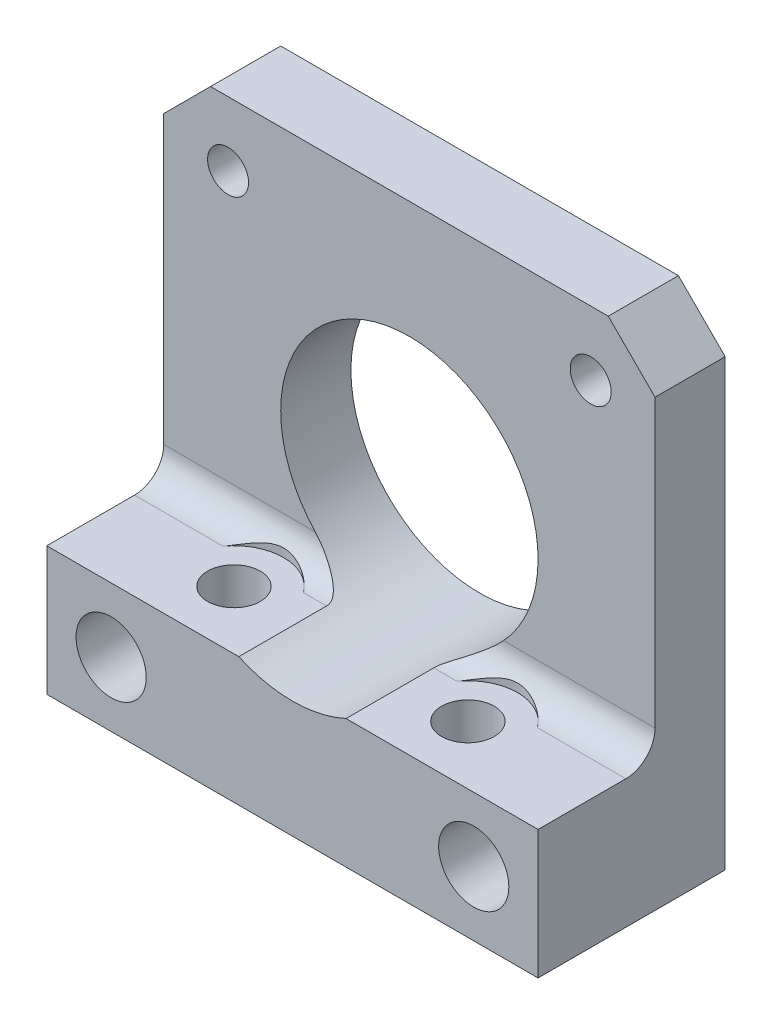
ISO-10303-21;
HEADER;
FILE_DESCRIPTION(('STEP AP214'),'2;1');
FILE_NAME('part.step','',(''),(''),'','','');
FILE_SCHEMA(('AUTOMOTIVE_DESIGN { 1 0 10303 214 1 1 1 1 }'));
ENDSEC;
DATA;
#1=APPLICATION_CONTEXT('core data for automotive mechanical design processes');
#2=APPLICATION_PROTOCOL_DEFINITION('international standard','automotive_design',2000,#1);
#3=PRODUCT_CONTEXT('',#1,'mechanical');
#4=PRODUCT('Part','Part','',(#3));
#5=PRODUCT_RELATED_PRODUCT_CATEGORY('part','',(#4));
#6=PRODUCT_DEFINITION_FORMATION('','',#4);
#7=PRODUCT_DEFINITION_CONTEXT('part definition',#1,'design');
#8=PRODUCT_DEFINITION('design','',#6,#7);
#9=PRODUCT_DEFINITION_SHAPE('','',#8);
#10=(LENGTH_UNIT() NAMED_UNIT(*) SI_UNIT(.MILLI.,.METRE.));
#11=(NAMED_UNIT(*) PLANE_ANGLE_UNIT() SI_UNIT($,.RADIAN.));
#12=(NAMED_UNIT(*) SI_UNIT($,.STERADIAN.) SOLID_ANGLE_UNIT());
#13=UNCERTAINTY_MEASURE_WITH_UNIT(LENGTH_MEASURE(1.E-05),#10,'distance_accuracy_value','');
#14=(GEOMETRIC_REPRESENTATION_CONTEXT(3) GLOBAL_UNCERTAINTY_ASSIGNED_CONTEXT((#13)) GLOBAL_UNIT_ASSIGNED_CONTEXT((#10,
#11,#12)) REPRESENTATION_CONTEXT('',''));
#15=CARTESIAN_POINT('',(0.,0.,0.));
#16=DIRECTION('',(0.,0.,1.));
#17=DIRECTION('',(1.,0.,0.));
#18=AXIS2_PLACEMENT_3D('',#15,#16,#17);
#19=CARTESIAN_POINT('',(-21.,-7.5,8.5));
#20=DIRECTION('',(1.,0.,0.));
#21=DIRECTION('',(0.,0.,-1.));
#22=AXIS2_PLACEMENT_3D('',#19,#20,#21);
#23=CYLINDRICAL_SURFACE('',#22,2.5);
#24=CARTESIAN_POINT('',(-13.4369317712169,-10.,8.5));
#25=CARTESIAN_POINT('',(-13.3736767965704,-9.99999618356325,8.41299325682662));
#26=CARTESIAN_POINT('',(-13.3071532453223,-9.99546167130543,8.32852394607757));
#27=CARTESIAN_POINT('',(-13.1684740677733,-9.97886685274589,8.16545650489552));
#28=CARTESIAN_POINT('',(-13.096332375148,-9.96682467697594,8.08684473939321));
#29=CARTESIAN_POINT('',(-12.9476116296134,-9.93685663332755,7.93647213440006));
#30=CARTESIAN_POINT('',(-12.8710729780745,-9.91897891567545,7.86466123354958));
#31=CARTESIAN_POINT('',(-12.7135575222297,-9.87869337935237,7.72738260424705));
#32=CARTESIAN_POINT('',(-12.6325777049683,-9.85628245686863,7.66191926754862));
#33=CARTESIAN_POINT('',(-12.4517332765327,-9.80393797031424,7.52631656235149));
#34=CARTESIAN_POINT('',(-12.3510925954655,-9.77337641532771,7.45745550247067));
#35=CARTESIAN_POINT('',(-12.1448344794991,-9.70990211579835,7.32890188518078));
#36=CARTESIAN_POINT('',(-12.0392164206318,-9.67698907620322,7.26921048130392));
#37=CARTESIAN_POINT('',(-11.8229898418857,-9.61083491850564,7.15890977395084));
#38=CARTESIAN_POINT('',(-11.7123671633849,-9.57759310828401,7.10832855287725));
#39=CARTESIAN_POINT('',(-11.4867506983562,-9.51317304773429,7.01667018400048));
#40=CARTESIAN_POINT('',(-11.3717583001318,-9.48199415048643,6.97559004652035));
#41=CARTESIAN_POINT('',(-11.0789229745892,-9.40972602691266,6.88513159837149));
#42=CARTESIAN_POINT('',(-10.8983570480611,-9.37145765247095,6.84184539496407));
#43=CARTESIAN_POINT('',(-10.622713680079,-9.32834928101204,6.79483732363149));
#44=CARTESIAN_POINT('',(-10.5302014624946,-9.31637083046183,6.78216152699683));
#45=CARTESIAN_POINT('',(-10.343970062805,-9.29797084052382,6.76290948773315));
#46=CARTESIAN_POINT('',(-10.2502509598634,-9.29154893852925,6.75633284708613));
#47=CARTESIAN_POINT('',(-10.0617917899725,-9.28477240703696,6.74939675099875));
#48=CARTESIAN_POINT('',(-9.96704897769375,-9.28445478156561,6.74907521375119));
#49=CARTESIAN_POINT('',(-9.77793912829719,-9.29000586110763,6.75475100424765));
#50=CARTESIAN_POINT('',(-9.68357209847319,-9.29587468561692,6.76074845404766));
#51=CARTESIAN_POINT('',(-9.49572591141823,-9.31333811746446,6.77896500769646));
#52=CARTESIAN_POINT('',(-9.40224982028795,-9.32494806377128,6.79120078165744));
#53=CARTESIAN_POINT('',(-9.21701109713077,-9.35302799513384,6.82169247043302));
#54=CARTESIAN_POINT('',(-9.12524955232062,-9.36950095964519,6.83995207671467));
#55=CARTESIAN_POINT('',(-8.80411134652349,-9.43452868932247,6.91486730613087));
#56=CARTESIAN_POINT('',(-8.58030581644891,-9.49343799958622,6.98736347630538));
#57=CARTESIAN_POINT('',(-8.25727167422108,-9.58663594007503,7.12197471168472));
#58=CARTESIAN_POINT('',(-8.15157974100833,-9.61855123681364,7.17123542341364));
#59=CARTESIAN_POINT('',(-7.94450020484713,-9.68204949175381,7.27830709290976));
#60=CARTESIAN_POINT('',(-7.8431121149628,-9.71363248724612,7.33611708007762));
#61=CARTESIAN_POINT('',(-7.57746253786431,-9.79532525473546,7.50251725423616));
#62=CARTESIAN_POINT('',(-7.41730156286126,-9.84343818967365,7.61891681704156));
#63=CARTESIAN_POINT('',(-7.18916848739681,-9.90403044519613,7.81071184814743));
#64=CARTESIAN_POINT('',(-7.11526139775998,-9.92227639686394,7.87737743695696));
#65=CARTESIAN_POINT('',(-6.9717954167563,-9.95379410121673,8.01630592334917));
#66=CARTESIAN_POINT('',(-6.90223366639453,-9.96706915382272,8.08856506907091));
#67=CARTESIAN_POINT('',(-6.78716183804682,-9.98451269274629,8.21695571460681));
#68=CARTESIAN_POINT('',(-6.74045048467771,-9.99019860897379,8.2718090475859));
#69=CARTESIAN_POINT('',(-6.64968480494346,-9.99794502801886,8.38406440392919));
#70=CARTESIAN_POINT('',(-6.60563504584181,-9.99999946085588,8.44147053041993));
#71=CARTESIAN_POINT('',(-6.56306822878312,-10.,8.5));
#72=B_SPLINE_CURVE_WITH_KNOTS('',3,(#24,#25,#26,#27,#28,#29,#30,#31,#32,#33,#34,#35,#36,#37,#38,
#39,#40,#41,#42,#43,#44,#45,#46,#47,#48,#49,#50,#51,#52,#53,#54,#55,#56,#57,#58,#59,#60,#61,#62,
#63,#64,#65,#66,#67,#68,#69,#70,#71),.UNSPECIFIED.,.F.,.F.,(4,2,2,2,2,2,2,2,2,2,2,2,2,2,2,2,2,2,
2,2,2,2,2,4),(0.,0.322350644668291,0.643925832341026,0.962912014782016,1.28211734576454,
1.65876243547026,2.03545486796295,2.41328930146921,2.79100468071832,3.35724508062752,
3.63936817002682,3.92147284737427,4.20528710292323,4.48910684065799,4.77368901077135,
5.05844590075495,5.78148620605999,6.14392890906228,6.5063304954842,7.11503257645169,
7.41832049620652,7.72140672045771,7.93804934813742,8.15505375014328),.UNSPECIFIED.);
#73=CARTESIAN_POINT('',(-13.4369317712169,-10.,8.5));
#74=VERTEX_POINT('',#73);
#75=CARTESIAN_POINT('',(-6.56306822878312,-10.,8.5));
#76=VERTEX_POINT('',#75);
#77=EDGE_CURVE('E149',#74,#76,#72,.T.);
#78=ORIENTED_EDGE('',*,*,#77,.T.);
#79=DIRECTION('',(-1.,0.,0.));
#80=VECTOR('',#79,1.);
#81=CARTESIAN_POINT('',(-21.,-10.,8.5));
#82=LINE('',#81,#80);
#83=CARTESIAN_POINT('',(-4.5825756949558,-10.,8.5));
#84=VERTEX_POINT('',#83);
#85=EDGE_CURVE('E297',#84,#76,#82,.T.);
#86=ORIENTED_EDGE('',*,*,#85,.F.);
#87=CARTESIAN_POINT('',(-8.04673846971552,-7.5,6.));
#88=CARTESIAN_POINT('',(-7.95386714442524,-7.5996710302166,6.00003103414965));
#89=CARTESIAN_POINT('',(-7.8591789413506,-7.69752175322278,6.00595755700125));
#90=CARTESIAN_POINT('',(-7.66699769287011,-7.88894158567436,6.02855548967686));
#91=CARTESIAN_POINT('',(-7.56950789643528,-7.98251535265925,6.04521489784045));
#92=CARTESIAN_POINT('',(-7.37209391217946,-8.16519456872849,6.08829129650574));
#93=CARTESIAN_POINT('',(-7.27216421924478,-8.25428818998738,6.11473271829137));
#94=CARTESIAN_POINT('',(-7.07072781079676,-8.42748174646896,6.17658913466857));
#95=CARTESIAN_POINT('',(-6.96922063219319,-8.51158017897022,6.21200681291285));
#96=CARTESIAN_POINT('',(-6.76298283366887,-8.67639808674789,6.29213337918878));
#97=CARTESIAN_POINT('',(-6.65823135258647,-8.75699749696402,6.33703495682333));
#98=CARTESIAN_POINT('',(-6.44850133910673,-8.91256837631275,6.43526850098936));
#99=CARTESIAN_POINT('',(-6.34352280187302,-8.98753972432662,6.48860064887427));
#100=CARTESIAN_POINT('',(-6.1344236232693,-9.13153456490374,6.60353860576782));
#101=CARTESIAN_POINT('',(-6.03030159674188,-9.20057086365992,6.66512582768581));
#102=CARTESIAN_POINT('',(-5.82383594434758,-9.33262700342529,6.79700577095205));
#103=CARTESIAN_POINT('',(-5.72149133048561,-9.39565028049999,6.86729346712224));
#104=CARTESIAN_POINT('',(-5.53398501082936,-9.50711430562465,7.00723035227061));
#105=CARTESIAN_POINT('',(-5.44839099409164,-9.55636976793574,7.07564634487743));
#106=CARTESIAN_POINT('',(-5.28126340632524,-9.64973645921936,7.22089837878199));
#107=CARTESIAN_POINT('',(-5.19973637325939,-9.69383954899308,7.29774738007029));
#108=CARTESIAN_POINT('',(-5.04289534688484,-9.77635551955456,7.46230666924363));
#109=CARTESIAN_POINT('',(-4.96765935063409,-9.81470064723573,7.550126890587));
#110=CARTESIAN_POINT('',(-4.82993707072984,-9.88319530281518,7.73821481104196));
#111=CARTESIAN_POINT('',(-4.76740075737949,-9.91337715195906,7.83843106107665));
#112=CARTESIAN_POINT('',(-4.68778668990944,-9.95116454534966,8.00456281999161));
#113=CARTESIAN_POINT('',(-4.66288974902919,-9.96282878465715,8.0657577634673));
#114=CARTESIAN_POINT('',(-4.62229782393996,-9.98172665554517,8.19169815546476));
#115=CARTESIAN_POINT('',(-4.60657066139216,-9.98897578455555,8.25643030565785));
#116=CARTESIAN_POINT('',(-4.59182069583853,-9.9957593907349,8.35148578075802));
#117=CARTESIAN_POINT('',(-4.5883702863823,-9.99734304727816,8.38102039118476));
#118=CARTESIAN_POINT('',(-4.58374206274924,-9.9994655741265,8.44036379213393));
#119=CARTESIAN_POINT('',(-4.58256886230142,-10.0000023233604,8.47017301659673));
#120=CARTESIAN_POINT('',(-4.5825756949558,-10.,8.5));
#121=B_SPLINE_CURVE_WITH_KNOTS('',3,(#87,#88,#89,#90,#91,#92,#93,#94,#95,#96,#97,#98,#99,#100,
#101,#102,#103,#104,#105,#106,#107,#108,#109,#110,#111,#112,#113,#114,#115,#116,#117,#118,#119,
#120),.UNSPECIFIED.,.F.,.F.,(4,2,2,2,2,2,2,2,2,2,2,2,2,2,2,2,4),(0.,0.408414030851302,
0.816372158310613,1.22535614606482,1.63446255327352,2.05285724758682,2.47126094338362,
2.88873791079982,3.30597486922085,3.66601806004669,4.02662253269252,4.39118414214763,
4.75428046319996,4.9548832058333,5.15477769477004,5.24401710489217,5.33343713016793),.UNSPECIFIED.);
#122=CARTESIAN_POINT('',(-8.04673846971552,-7.5,6.));
#123=VERTEX_POINT('',#122);
#124=EDGE_CURVE('E161',#123,#84,#121,.T.);
#125=ORIENTED_EDGE('',*,*,#124,.F.);
#126=DIRECTION('',(-1.,0.,0.));
#127=VECTOR('',#126,1.);
#128=CARTESIAN_POINT('',(-4.5825756949558,-7.5,6.));
#129=LINE('',#128,#127);
#130=CARTESIAN_POINT('',(-21.,-7.5,6.));
#131=VERTEX_POINT('',#130);
#132=EDGE_CURVE('E153',#131,#123,#129,.F.);
#133=ORIENTED_EDGE('',*,*,#132,.F.);
#134=CARTESIAN_POINT('',(-21.,-7.5,8.5));
#135=DIRECTION('',(1.,0.,0.));
#136=DIRECTION('',(0.,0.,-1.));
#137=AXIS2_PLACEMENT_3D('',#134,#135,#136);
#138=CIRCLE('',#137,2.5);
#139=CARTESIAN_POINT('',(-21.,-10.,8.5));
#140=VERTEX_POINT('',#139);
#141=EDGE_CURVE('E155',#140,#131,#138,.T.);
#142=ORIENTED_EDGE('',*,*,#141,.F.);
#143=EDGE_CURVE('E296',#74,#140,#82,.T.);
#144=ORIENTED_EDGE('',*,*,#143,.F.);
#145=EDGE_LOOP('',(#78,#86,#125,#133,#142,#144));
#146=FACE_BOUND('',#145,.T.);
#147=ADVANCED_FACE('F35',(#146),#23,.F.);
#148=CARTESIAN_POINT('',(-21.,-7.5,8.5));
#149=DIRECTION('',(1.,0.,0.));
#150=DIRECTION('',(0.,0.,-1.));
#151=AXIS2_PLACEMENT_3D('',#148,#149,#150);
#152=CYLINDRICAL_SURFACE('',#151,2.5);
#153=CARTESIAN_POINT('',(6.56306822878312,-10.,8.5));
#154=CARTESIAN_POINT('',(6.62632320342962,-9.99999618356325,8.41299325682662));
#155=CARTESIAN_POINT('',(6.69284675467769,-9.99546167130543,8.32852394607757));
#156=CARTESIAN_POINT('',(6.83152593222666,-9.97886685274589,8.16545650489552));
#157=CARTESIAN_POINT('',(6.90366762485202,-9.96682467697594,8.08684473939321));
#158=CARTESIAN_POINT('',(7.05238837038661,-9.93685663332755,7.93647213440006));
#159=CARTESIAN_POINT('',(7.12892702192547,-9.91897891567545,7.86466123354958));
#160=CARTESIAN_POINT('',(7.2864424777703,-9.87869337935237,7.72738260424705));
#161=CARTESIAN_POINT('',(7.36742229503173,-9.85628245686863,7.66191926754862));
#162=CARTESIAN_POINT('',(7.54826672346726,-9.80393797031424,7.52631656235149));
#163=CARTESIAN_POINT('',(7.64890740453446,-9.77337641532771,7.45745550247067));
#164=CARTESIAN_POINT('',(7.85516552050091,-9.70990211579835,7.32890188518078));
#165=CARTESIAN_POINT('',(7.96078357936822,-9.67698907620322,7.26921048130392));
#166=CARTESIAN_POINT('',(8.17701015811427,-9.61083491850564,7.15890977395084));
#167=CARTESIAN_POINT('',(8.28763283661512,-9.57759310828401,7.10832855287725));
#168=CARTESIAN_POINT('',(8.51324930164385,-9.51317304773429,7.01667018400048));
#169=CARTESIAN_POINT('',(8.62824169986824,-9.48199415048643,6.97559004652035));
#170=CARTESIAN_POINT('',(8.92107702541082,-9.40972602691266,6.88513159837149));
#171=CARTESIAN_POINT('',(9.10164295193886,-9.37145765247095,6.84184539496407));
#172=CARTESIAN_POINT('',(9.37728631992097,-9.32834928101204,6.79483732363149));
#173=CARTESIAN_POINT('',(9.46979853750545,-9.31637083046184,6.78216152699683));
#174=CARTESIAN_POINT('',(9.65602993719502,-9.29797084052383,6.76290948773315));
#175=CARTESIAN_POINT('',(9.74974904013659,-9.29154893852925,6.75633284708613));
#176=CARTESIAN_POINT('',(9.93820821002755,-9.28477240703696,6.74939675099876));
#177=CARTESIAN_POINT('',(10.0329510223062,-9.28445478156561,6.74907521375119));
#178=CARTESIAN_POINT('',(10.2220608717028,-9.29000586110763,6.75475100424765));
#179=CARTESIAN_POINT('',(10.3164279015268,-9.29587468561692,6.76074845404766));
#180=CARTESIAN_POINT('',(10.5042740885818,-9.31333811746446,6.77896500769647));
#181=CARTESIAN_POINT('',(10.5977501797121,-9.32494806377128,6.79120078165744));
#182=CARTESIAN_POINT('',(10.7829889028692,-9.35302799513384,6.82169247043303));
#183=CARTESIAN_POINT('',(10.8747504476794,-9.36950095964519,6.83995207671467));
#184=CARTESIAN_POINT('',(11.1958886534765,-9.43452868932247,6.91486730613087));
#185=CARTESIAN_POINT('',(11.4196941835511,-9.49343799958622,6.98736347630538));
#186=CARTESIAN_POINT('',(11.7427283257789,-9.58663594007503,7.12197471168472));
#187=CARTESIAN_POINT('',(11.8484202589917,-9.61855123681364,7.17123542341364));
#188=CARTESIAN_POINT('',(12.0554997951529,-9.68204949175381,7.27830709290976));
#189=CARTESIAN_POINT('',(12.1568878850372,-9.71363248724612,7.33611708007762));
#190=CARTESIAN_POINT('',(12.4225374621357,-9.79532525473546,7.50251725423616));
#191=CARTESIAN_POINT('',(12.5826984371387,-9.84343818967365,7.61891681704156));
#192=CARTESIAN_POINT('',(12.8108315126032,-9.90403044519613,7.81071184814743));
#193=CARTESIAN_POINT('',(12.88473860224,-9.92227639686394,7.87737743695696));
#194=CARTESIAN_POINT('',(13.0282045832437,-9.95379410121673,8.01630592334917));
#195=CARTESIAN_POINT('',(13.0977663336055,-9.96706915382272,8.08856506907091));
#196=CARTESIAN_POINT('',(13.2128381619532,-9.98451269274629,8.21695571460681));
#197=CARTESIAN_POINT('',(13.2595495153223,-9.99019860897379,8.2718090475859));
#198=CARTESIAN_POINT('',(13.3503151950565,-9.99794502801886,8.38406440392919));
#199=CARTESIAN_POINT('',(13.3943649541582,-9.99999946085589,8.44147053041993));
#200=CARTESIAN_POINT('',(13.4369317712169,-10.,8.5));
#201=B_SPLINE_CURVE_WITH_KNOTS('',3,(#153,#154,#155,#156,#157,#158,#159,#160,#161,#162,#163,
#164,#165,#166,#167,#168,#169,#170,#171,#172,#173,#174,#175,#176,#177,#178,#179,#180,#181,#182,
#183,#184,#185,#186,#187,#188,#189,#190,#191,#192,#193,#194,#195,#196,#197,#198,#199,#200),
.UNSPECIFIED.,.F.,.F.,(4,2,2,2,2,2,2,2,2,2,2,2,2,2,2,2,2,2,2,2,2,2,2,4),(0.,0.322350644668291,
0.643925832341027,0.962912014782018,1.28211734576454,1.65876243547026,2.03545486796295,
2.41328930146921,2.79100468071832,3.35724508062752,3.63936817002682,3.92147284737426,
4.20528710292322,4.48910684065799,4.77368901077134,5.05844590075494,5.78148620605999,
6.14392890906228,6.50633049548419,7.11503257645168,7.41832049620651,7.72140672045771,
7.93804934813741,8.15505375014327),.UNSPECIFIED.);
#202=CARTESIAN_POINT('',(6.56306822878312,-10.,8.5));
#203=VERTEX_POINT('',#202);
#204=CARTESIAN_POINT('',(13.4369317712169,-10.,8.5));
#205=VERTEX_POINT('',#204);
#206=EDGE_CURVE('E135',#203,#205,#201,.T.);
#207=ORIENTED_EDGE('',*,*,#206,.T.);
#208=DIRECTION('',(-1.,0.,0.));
#209=VECTOR('',#208,1.);
#210=CARTESIAN_POINT('',(4.58257569495582,-10.,8.5));
#211=LINE('',#210,#209);
#212=CARTESIAN_POINT('',(21.,-10.,8.5));
#213=VERTEX_POINT('',#212);
#214=EDGE_CURVE('E148',#213,#205,#211,.T.);
#215=ORIENTED_EDGE('',*,*,#214,.F.);
#216=CARTESIAN_POINT('',(21.,-7.5,8.5));
#217=DIRECTION('',(-1.,0.,0.));
#218=DIRECTION('',(0.,-1.,0.));
#219=AXIS2_PLACEMENT_3D('',#216,#217,#218);
#220=CIRCLE('',#219,2.5);
#221=CARTESIAN_POINT('',(21.,-7.5,6.));
#222=VERTEX_POINT('',#221);
#223=EDGE_CURVE('E11',#222,#213,#220,.T.);
#224=ORIENTED_EDGE('',*,*,#223,.F.);
#225=DIRECTION('',(-1.,0.,0.));
#226=VECTOR('',#225,1.);
#227=CARTESIAN_POINT('',(21.,-7.5,6.));
#228=LINE('',#227,#226);
#229=CARTESIAN_POINT('',(8.04673846971554,-7.5,6.));
#230=VERTEX_POINT('',#229);
#231=EDGE_CURVE('E156',#230,#222,#228,.F.);
#232=ORIENTED_EDGE('',*,*,#231,.F.);
#233=CARTESIAN_POINT('',(4.58257569495582,-10.,8.5));
#234=CARTESIAN_POINT('',(4.58256198788902,-10.0000049729469,8.46657349640645));
#235=CARTESIAN_POINT('',(4.58403974983893,-9.9993291743257,8.43316825956703));
#236=CARTESIAN_POINT('',(4.58984938431142,-9.99666437867537,8.36671068360719));
#237=CARTESIAN_POINT('',(4.59417679646849,-9.99467743388497,8.33365787488241));
#238=CARTESIAN_POINT('',(4.61107826587798,-9.98689707018748,8.23631331022385));
#239=CARTESIAN_POINT('',(4.62757988286757,-9.97928089551309,8.17282443210834));
#240=CARTESIAN_POINT('',(4.67566401325069,-9.95685950879249,8.03036646137881));
#241=CARTESIAN_POINT('',(4.71033887206504,-9.94055604611863,7.9527149741941));
#242=CARTESIAN_POINT('',(4.79004225699407,-9.90239631455494,7.80397775406192));
#243=CARTESIAN_POINT('',(4.83513841014481,-9.88050367404667,7.7329393544305));
#244=CARTESIAN_POINT('',(4.92715526507514,-9.83491289256672,7.60426127908525));
#245=CARTESIAN_POINT('',(4.97342139097755,-9.81162628061859,7.5459939470687));
#246=CARTESIAN_POINT('',(5.06980973430454,-9.76217019792953,7.4340095715131));
#247=CARTESIAN_POINT('',(5.11993511781158,-9.73599835241522,7.38029634165599));
#248=CARTESIAN_POINT('',(5.2229605233667,-9.68112063493581,7.27682938583495));
#249=CARTESIAN_POINT('',(5.27586470710317,-9.65241091550188,7.22708189689401));
#250=CARTESIAN_POINT('',(5.38362511789026,-9.59272552671646,7.13117311408198));
#251=CARTESIAN_POINT('',(5.43848204568933,-9.5617490396314,7.08501312690403));
#252=CARTESIAN_POINT('',(5.59814885409097,-9.46969562166529,6.95698469316146));
#253=CARTESIAN_POINT('',(5.70470647444688,-9.40597689336171,6.87917465852083));
#254=CARTESIAN_POINT('',(5.92034960011736,-9.27176577886819,6.73346518727255));
#255=CARTESIAN_POINT('',(6.02943690589723,-9.20126844836372,6.66557307713709));
#256=CARTESIAN_POINT('',(6.24860324056015,-9.05386042456411,6.53914880046766));
#257=CARTESIAN_POINT('',(6.35868179606985,-8.9769526613048,6.48061239300283));
#258=CARTESIAN_POINT('',(6.57881911247718,-8.8168965637621,6.37277374560409));
#259=CARTESIAN_POINT('',(6.68887787369011,-8.73374833973655,6.32347134257553));
#260=CARTESIAN_POINT('',(6.90630208367089,-8.56281453795252,6.2351548155276));
#261=CARTESIAN_POINT('',(7.01368194236017,-8.47512863067517,6.19598375149767));
#262=CARTESIAN_POINT('',(7.22680396242801,-8.29414568855321,6.12751452163498));
#263=CARTESIAN_POINT('',(7.3325466388509,-8.20085046538983,6.09821318807684));
#264=CARTESIAN_POINT('',(7.5415710865321,-8.00904225491197,6.05037881016687));
#265=CARTESIAN_POINT('',(7.64485512102098,-7.91053435836333,6.03183546373422));
#266=CARTESIAN_POINT('',(7.8483505020232,-7.70870313649013,6.00665822983009));
#267=CARTESIAN_POINT('',(7.94855786448904,-7.60537397076267,6.00003919284163));
#268=CARTESIAN_POINT('',(8.04673846971554,-7.5,6.));
#269=B_SPLINE_CURVE_WITH_KNOTS('',3,(#233,#234,#235,#236,#237,#238,#239,#240,#241,#242,#243,
#244,#245,#246,#247,#248,#249,#250,#251,#252,#253,#254,#255,#256,#257,#258,#259,#260,#261,#262,
#263,#264,#265,#266,#267,#268),.UNSPECIFIED.,.F.,.F.,(4,2,2,2,2,2,2,2,2,2,2,2,2,2,2,2,2,4),(0.,
0.100201945742927,0.200247423741392,0.397353042977793,0.655686562145684,0.915746057797691,
1.14929620183457,1.38304003177163,1.61714450721308,1.85133385588742,2.29024165139993,
2.7294720506093,3.1685027789308,3.60752575218575,4.03927411798272,4.47088378026127,
4.90207943864641,5.33381173596131),.UNSPECIFIED.);
#270=CARTESIAN_POINT('',(4.58257569495582,-10.,8.5));
#271=VERTEX_POINT('',#270);
#272=EDGE_CURVE('E45',#271,#230,#269,.T.);
#273=ORIENTED_EDGE('',*,*,#272,.F.);
#274=EDGE_CURVE('E146',#203,#271,#211,.T.);
#275=ORIENTED_EDGE('',*,*,#274,.F.);
#276=EDGE_LOOP('',(#207,#215,#224,#232,#273,#275));
#277=FACE_BOUND('',#276,.T.);
#278=ADVANCED_FACE('F37',(#277),#152,.F.);
#279=CARTESIAN_POINT('',(-21.,-10.,16.));
#280=DIRECTION('',(0.,-1.,0.));
#281=DIRECTION('',(0.,0.,-1.));
#282=AXIS2_PLACEMENT_3D('',#279,#280,#281);
#283=PLANE('',#282);
#284=CARTESIAN_POINT('',(-10.,-10.,11.));
#285=DIRECTION('',(0.,-1.,0.));
#286=DIRECTION('',(0.,0.,-1.));
#287=AXIS2_PLACEMENT_3D('',#284,#285,#286);
#288=CIRCLE('',#287,2.25);
#289=CARTESIAN_POINT('',(-10.,-10.,8.75));
#290=VERTEX_POINT('',#289);
#291=EDGE_CURVE('E405',#290,#290,#288,.F.);
#292=ORIENTED_EDGE('',*,*,#291,.F.);
#293=EDGE_LOOP('',(#292));
#294=FACE_BOUND('',#293,.T.);
#295=DIRECTION('',(0.,0.,-1.));
#296=VECTOR('',#295,1.);
#297=CARTESIAN_POINT('',(-4.5825756949558,-10.,47.1126983722081));
#298=LINE('',#297,#296);
#299=CARTESIAN_POINT('',(-4.5825756949558,-10.,16.));
#300=VERTEX_POINT('',#299);
#301=EDGE_CURVE('E325',#300,#84,#298,.T.);
#302=ORIENTED_EDGE('',*,*,#301,.T.);
#303=ORIENTED_EDGE('',*,*,#85,.T.);
#304=CARTESIAN_POINT('',(-10.,-10.,11.));
#305=DIRECTION('',(0.,1.,0.));
#306=DIRECTION('',(0.,0.,1.));
#307=AXIS2_PLACEMENT_3D('',#304,#305,#306);
#308=CIRCLE('',#307,4.25);
#309=EDGE_CURVE('E52',#76,#74,#308,.T.);
#310=ORIENTED_EDGE('',*,*,#309,.T.);
#311=ORIENTED_EDGE('',*,*,#143,.T.);
#312=DIRECTION('',(0.,0.,-1.));
#313=VECTOR('',#312,1.);
#314=CARTESIAN_POINT('',(-21.,-10.,16.));
#315=LINE('',#314,#313);
#316=CARTESIAN_POINT('',(-21.,-10.,16.));
#317=VERTEX_POINT('',#316);
#318=EDGE_CURVE('E243',#317,#140,#315,.T.);
#319=ORIENTED_EDGE('',*,*,#318,.F.);
#320=DIRECTION('',(-1.,0.,0.));
#321=VECTOR('',#320,1.);
#322=CARTESIAN_POINT('',(-21.,-10.,16.));
#323=LINE('',#322,#321);
#324=EDGE_CURVE('E244',#300,#317,#323,.T.);
#325=ORIENTED_EDGE('',*,*,#324,.F.);
#326=EDGE_LOOP('',(#302,#303,#310,#311,#319,#325));
#327=FACE_BOUND('',#326,.T.);
#328=ADVANCED_FACE('F213',(#294,#327),#283,.F.);
#329=CARTESIAN_POINT('',(0.,0.,6.));
#330=DIRECTION('',(0.,0.,-1.));
#331=DIRECTION('',(-1.,0.,0.));
#332=AXIS2_PLACEMENT_3D('',#329,#330,#331);
#333=PLANE('',#332);
#334=CARTESIAN_POINT('',(-15.5,15.5,6.));
#335=DIRECTION('',(0.,0.,-1.));
#336=DIRECTION('',(-1.,0.,0.));
#337=AXIS2_PLACEMENT_3D('',#334,#335,#336);
#338=CIRCLE('',#337,1.75);
#339=CARTESIAN_POINT('',(-17.25,15.5,6.));
#340=VERTEX_POINT('',#339);
#341=EDGE_CURVE('E335',#340,#340,#338,.T.);
#342=ORIENTED_EDGE('',*,*,#341,.T.);
#343=EDGE_LOOP('',(#342));
#344=FACE_BOUND('',#343,.T.);
#345=CARTESIAN_POINT('',(15.5,15.5,6.));
#346=DIRECTION('',(0.,0.,-1.));
#347=DIRECTION('',(-1.,0.,0.));
#348=AXIS2_PLACEMENT_3D('',#345,#346,#347);
#349=CIRCLE('',#348,1.75);
#350=CARTESIAN_POINT('',(13.75,15.5,6.));
#351=VERTEX_POINT('',#350);
#352=EDGE_CURVE('E328',#351,#351,#349,.T.);
#353=ORIENTED_EDGE('',*,*,#352,.T.);
#354=EDGE_LOOP('',(#353));
#355=FACE_BOUND('',#354,.T.);
#356=DIRECTION('',(0.,-1.,0.));
#357=VECTOR('',#356,1.);
#358=CARTESIAN_POINT('',(-21.,21.,6.));
#359=LINE('',#358,#357);
#360=CARTESIAN_POINT('',(-21.,17.,6.));
#361=VERTEX_POINT('',#360);
#362=EDGE_CURVE('E254',#361,#131,#359,.T.);
#363=ORIENTED_EDGE('',*,*,#362,.T.);
#364=ORIENTED_EDGE('',*,*,#132,.T.);
#365=CARTESIAN_POINT('',(0.,0.,6.));
#366=DIRECTION('',(0.,0.,-1.));
#367=DIRECTION('',(-1.,0.,0.));
#368=AXIS2_PLACEMENT_3D('',#365,#366,#367);
#369=CIRCLE('',#368,11.);
#370=EDGE_CURVE('E303',#123,#230,#369,.T.);
#371=ORIENTED_EDGE('',*,*,#370,.T.);
#372=ORIENTED_EDGE('',*,*,#231,.T.);
#373=DIRECTION('',(0.,1.,0.));
#374=VECTOR('',#373,1.);
#375=CARTESIAN_POINT('',(21.,21.,6.));
#376=LINE('',#375,#374);
#377=CARTESIAN_POINT('',(21.,17.,6.));
#378=VERTEX_POINT('',#377);
#379=EDGE_CURVE('E257',#222,#378,#376,.T.);
#380=ORIENTED_EDGE('',*,*,#379,.T.);
#381=DIRECTION('',(0.707106781186547,-0.707106781186548,0.));
#382=VECTOR('',#381,1.);
#383=CARTESIAN_POINT('',(17.,21.,6.));
#384=LINE('',#383,#382);
#385=CARTESIAN_POINT('',(17.,21.,6.));
#386=VERTEX_POINT('',#385);
#387=EDGE_CURVE('E289',#378,#386,#384,.F.);
#388=ORIENTED_EDGE('',*,*,#387,.T.);
#389=DIRECTION('',(-1.,0.,0.));
#390=VECTOR('',#389,1.);
#391=CARTESIAN_POINT('',(21.,21.,6.));
#392=LINE('',#391,#390);
#393=CARTESIAN_POINT('',(-17.,21.,6.));
#394=VERTEX_POINT('',#393);
#395=EDGE_CURVE('E260',#386,#394,#392,.T.);
#396=ORIENTED_EDGE('',*,*,#395,.T.);
#397=DIRECTION('',(0.707106781186548,0.707106781186547,0.));
#398=VECTOR('',#397,1.);
#399=CARTESIAN_POINT('',(-21.,17.,6.));
#400=LINE('',#399,#398);
#401=EDGE_CURVE('E291',#394,#361,#400,.F.);
#402=ORIENTED_EDGE('',*,*,#401,.T.);
#403=EDGE_LOOP('',(#363,#364,#371,#372,#380,#388,#396,#402));
#404=FACE_BOUND('',#403,.T.);
#405=ADVANCED_FACE('F194',(#344,#355,#404),#333,.F.);
#406=CARTESIAN_POINT('',(-21.,21.,6.));
#407=DIRECTION('',(1.,0.,0.));
#408=DIRECTION('',(0.,0.,-1.));
#409=AXIS2_PLACEMENT_3D('',#406,#407,#408);
#410=PLANE('',#409);
#411=ORIENTED_EDGE('',*,*,#362,.F.);
#412=DIRECTION('',(0.,0.,-1.));
#413=VECTOR('',#412,1.);
#414=CARTESIAN_POINT('',(-21.,17.,6.));
#415=LINE('',#414,#413);
#416=CARTESIAN_POINT('',(-21.,17.,0.));
#417=VERTEX_POINT('',#416);
#418=EDGE_CURVE('E277',#361,#417,#415,.T.);
#419=ORIENTED_EDGE('',*,*,#418,.T.);
#420=DIRECTION('',(0.,-1.,0.));
#421=VECTOR('',#420,1.);
#422=CARTESIAN_POINT('',(-21.,21.,0.));
#423=LINE('',#422,#421);
#424=CARTESIAN_POINT('',(-21.,-21.,0.));
#425=VERTEX_POINT('',#424);
#426=EDGE_CURVE('E253',#417,#425,#423,.T.);
#427=ORIENTED_EDGE('',*,*,#426,.T.);
#428=DIRECTION('',(0.,0.,-1.));
#429=VECTOR('',#428,1.);
#430=CARTESIAN_POINT('',(-21.,-21.,6.));
#431=LINE('',#430,#429);
#432=CARTESIAN_POINT('',(-21.,-21.,16.));
#433=VERTEX_POINT('',#432);
#434=EDGE_CURVE('E274',#433,#425,#431,.T.);
#435=ORIENTED_EDGE('',*,*,#434,.F.);
#436=DIRECTION('',(0.,-1.,0.));
#437=VECTOR('',#436,1.);
#438=CARTESIAN_POINT('',(-21.,-21.,16.));
#439=LINE('',#438,#437);
#440=EDGE_CURVE('E338',#317,#433,#439,.T.);
#441=ORIENTED_EDGE('',*,*,#440,.F.);
#442=ORIENTED_EDGE('',*,*,#318,.T.);
#443=ORIENTED_EDGE('',*,*,#141,.T.);
#444=EDGE_LOOP('',(#411,#419,#427,#435,#441,#442,#443));
#445=FACE_BOUND('',#444,.T.);
#446=ADVANCED_FACE('F190',(#445),#410,.F.);
#447=CARTESIAN_POINT('',(21.,-21.,6.));
#448=DIRECTION('',(0.,1.,0.));
#449=DIRECTION('',(-1.,0.,0.));
#450=AXIS2_PLACEMENT_3D('',#447,#448,#449);
#451=PLANE('',#450);
#452=CARTESIAN_POINT('',(-10.,-21.,11.));
#453=DIRECTION('',(0.,-1.,0.));
#454=DIRECTION('',(1.,0.,0.));
#455=AXIS2_PLACEMENT_3D('',#452,#453,#454);
#456=CIRCLE('',#455,2.25);
#457=CARTESIAN_POINT('',(-7.75,-21.,11.));
#458=VERTEX_POINT('',#457);
#459=EDGE_CURVE('E411',#458,#458,#456,.T.);
#460=ORIENTED_EDGE('',*,*,#459,.F.);
#461=EDGE_LOOP('',(#460));
#462=FACE_BOUND('',#461,.T.);
#463=CARTESIAN_POINT('',(10.,-21.,11.));
#464=DIRECTION('',(0.,-1.,0.));
#465=DIRECTION('',(1.,0.,0.));
#466=AXIS2_PLACEMENT_3D('',#463,#464,#465);
#467=CIRCLE('',#466,2.25);
#468=CARTESIAN_POINT('',(12.25,-21.,11.));
#469=VERTEX_POINT('',#468);
#470=EDGE_CURVE('E427',#469,#469,#467,.T.);
#471=ORIENTED_EDGE('',*,*,#470,.F.);
#472=EDGE_LOOP('',(#471));
#473=FACE_BOUND('',#472,.T.);
#474=DIRECTION('',(1.,0.,0.));
#475=VECTOR('',#474,1.);
#476=CARTESIAN_POINT('',(21.,-21.,0.));
#477=LINE('',#476,#475);
#478=CARTESIAN_POINT('',(21.,-21.,0.));
#479=VERTEX_POINT('',#478);
#480=EDGE_CURVE('E265',#425,#479,#477,.T.);
#481=ORIENTED_EDGE('',*,*,#480,.T.);
#482=DIRECTION('',(0.,0.,-1.));
#483=VECTOR('',#482,1.);
#484=CARTESIAN_POINT('',(21.,-21.,6.));
#485=LINE('',#484,#483);
#486=CARTESIAN_POINT('',(21.,-21.,16.));
#487=VERTEX_POINT('',#486);
#488=EDGE_CURVE('E263',#487,#479,#485,.T.);
#489=ORIENTED_EDGE('',*,*,#488,.F.);
#490=DIRECTION('',(1.,0.,0.));
#491=VECTOR('',#490,1.);
#492=CARTESIAN_POINT('',(-21.,-21.,16.));
#493=LINE('',#492,#491);
#494=EDGE_CURVE('E340',#433,#487,#493,.T.);
#495=ORIENTED_EDGE('',*,*,#494,.F.);
#496=ORIENTED_EDGE('',*,*,#434,.T.);
#497=EDGE_LOOP('',(#481,#489,#495,#496));
#498=FACE_BOUND('',#497,.T.);
#499=ADVANCED_FACE('F193',(#462,#473,#498),#451,.F.);
#500=CARTESIAN_POINT('',(21.,21.,6.));
#501=DIRECTION('',(-1.,0.,0.));
#502=DIRECTION('',(0.,-1.,0.));
#503=AXIS2_PLACEMENT_3D('',#500,#501,#502);
#504=PLANE('',#503);
#505=DIRECTION('',(0.,1.,0.));
#506=VECTOR('',#505,1.);
#507=CARTESIAN_POINT('',(21.,21.,0.));
#508=LINE('',#507,#506);
#509=CARTESIAN_POINT('',(21.,17.,0.));
#510=VERTEX_POINT('',#509);
#511=EDGE_CURVE('E267',#479,#510,#508,.T.);
#512=ORIENTED_EDGE('',*,*,#511,.T.);
#513=DIRECTION('',(0.,0.,1.));
#514=VECTOR('',#513,1.);
#515=CARTESIAN_POINT('',(21.,17.,6.));
#516=LINE('',#515,#514);
#517=EDGE_CURVE('E293',#510,#378,#516,.T.);
#518=ORIENTED_EDGE('',*,*,#517,.T.);
#519=ORIENTED_EDGE('',*,*,#379,.F.);
#520=ORIENTED_EDGE('',*,*,#223,.T.);
#521=DIRECTION('',(0.,0.,-1.));
#522=VECTOR('',#521,1.);
#523=CARTESIAN_POINT('',(21.,-10.,16.));
#524=LINE('',#523,#522);
#525=CARTESIAN_POINT('',(21.,-10.,16.));
#526=VERTEX_POINT('',#525);
#527=EDGE_CURVE('E247',#526,#213,#524,.T.);
#528=ORIENTED_EDGE('',*,*,#527,.F.);
#529=DIRECTION('',(0.,1.,0.));
#530=VECTOR('',#529,1.);
#531=CARTESIAN_POINT('',(21.,-21.,16.));
#532=LINE('',#531,#530);
#533=EDGE_CURVE('E241',#487,#526,#532,.T.);
#534=ORIENTED_EDGE('',*,*,#533,.F.);
#535=ORIENTED_EDGE('',*,*,#488,.T.);
#536=EDGE_LOOP('',(#512,#518,#519,#520,#528,#534,#535));
#537=FACE_BOUND('',#536,.T.);
#538=ADVANCED_FACE('F198',(#537),#504,.F.);
#539=CARTESIAN_POINT('',(21.,21.,6.));
#540=DIRECTION('',(0.,-1.,0.));
#541=DIRECTION('',(1.,0.,0.));
#542=AXIS2_PLACEMENT_3D('',#539,#540,#541);
#543=PLANE('',#542);
#544=DIRECTION('',(-1.,0.,0.));
#545=VECTOR('',#544,1.);
#546=CARTESIAN_POINT('',(21.,21.,0.));
#547=LINE('',#546,#545);
#548=CARTESIAN_POINT('',(17.,21.,0.));
#549=VERTEX_POINT('',#548);
#550=CARTESIAN_POINT('',(-17.,21.,0.));
#551=VERTEX_POINT('',#550);
#552=EDGE_CURVE('E258',#549,#551,#547,.T.);
#553=ORIENTED_EDGE('',*,*,#552,.T.);
#554=DIRECTION('',(0.,0.,1.));
#555=VECTOR('',#554,1.);
#556=CARTESIAN_POINT('',(-17.,21.,6.));
#557=LINE('',#556,#555);
#558=EDGE_CURVE('E287',#551,#394,#557,.T.);
#559=ORIENTED_EDGE('',*,*,#558,.T.);
#560=ORIENTED_EDGE('',*,*,#395,.F.);
#561=DIRECTION('',(0.,0.,-1.));
#562=VECTOR('',#561,1.);
#563=CARTESIAN_POINT('',(17.,21.,6.));
#564=LINE('',#563,#562);
#565=EDGE_CURVE('E284',#386,#549,#564,.T.);
#566=ORIENTED_EDGE('',*,*,#565,.T.);
#567=EDGE_LOOP('',(#553,#559,#560,#566));
#568=FACE_BOUND('',#567,.T.);
#569=ADVANCED_FACE('F202',(#568),#543,.F.);
#570=CARTESIAN_POINT('',(0.,0.,0.));
#571=DIRECTION('',(0.,0.,-1.));
#572=DIRECTION('',(-1.,0.,0.));
#573=AXIS2_PLACEMENT_3D('',#570,#571,#572);
#574=PLANE('',#573);
#575=CARTESIAN_POINT('',(15.5,-15.5,0.));
#576=DIRECTION('',(0.,0.,-1.));
#577=DIRECTION('',(-1.,0.,0.));
#578=AXIS2_PLACEMENT_3D('',#575,#576,#577);
#579=CIRCLE('',#578,1.75);
#580=CARTESIAN_POINT('',(13.75,-15.5,0.));
#581=VERTEX_POINT('',#580);
#582=EDGE_CURVE('E403',#581,#581,#579,.T.);
#583=ORIENTED_EDGE('',*,*,#582,.F.);
#584=EDGE_LOOP('',(#583));
#585=FACE_BOUND('',#584,.T.);
#586=CARTESIAN_POINT('',(-15.5,-15.5,0.));
#587=DIRECTION('',(0.,0.,-1.));
#588=DIRECTION('',(-1.,0.,0.));
#589=AXIS2_PLACEMENT_3D('',#586,#587,#588);
#590=CIRCLE('',#589,1.75);
#591=CARTESIAN_POINT('',(-17.25,-15.5,0.));
#592=VERTEX_POINT('',#591);
#593=EDGE_CURVE('E404',#592,#592,#590,.T.);
#594=ORIENTED_EDGE('',*,*,#593,.F.);
#595=EDGE_LOOP('',(#594));
#596=FACE_BOUND('',#595,.T.);
#597=CARTESIAN_POINT('',(-15.5,15.5,0.));
#598=DIRECTION('',(0.,0.,-1.));
#599=DIRECTION('',(-1.,0.,0.));
#600=AXIS2_PLACEMENT_3D('',#597,#598,#599);
#601=CIRCLE('',#600,1.75);
#602=CARTESIAN_POINT('',(-17.25,15.5,0.));
#603=VERTEX_POINT('',#602);
#604=EDGE_CURVE('E408',#603,#603,#601,.T.);
#605=ORIENTED_EDGE('',*,*,#604,.F.);
#606=EDGE_LOOP('',(#605));
#607=FACE_BOUND('',#606,.T.);
#608=CARTESIAN_POINT('',(15.5,15.5,0.));
#609=DIRECTION('',(0.,0.,-1.));
#610=DIRECTION('',(-1.,0.,0.));
#611=AXIS2_PLACEMENT_3D('',#608,#609,#610);
#612=CIRCLE('',#611,1.75);
#613=CARTESIAN_POINT('',(13.75,15.5,0.));
#614=VERTEX_POINT('',#613);
#615=EDGE_CURVE('E417',#614,#614,#612,.T.);
#616=ORIENTED_EDGE('',*,*,#615,.F.);
#617=EDGE_LOOP('',(#616));
#618=FACE_BOUND('',#617,.T.);
#619=CARTESIAN_POINT('',(0.,0.,0.));
#620=DIRECTION('',(0.,0.,-1.));
#621=DIRECTION('',(-1.,0.,0.));
#622=AXIS2_PLACEMENT_3D('',#619,#620,#621);
#623=CIRCLE('',#622,11.);
#624=CARTESIAN_POINT('',(-11.,0.,0.));
#625=VERTEX_POINT('',#624);
#626=EDGE_CURVE('E415',#625,#625,#623,.T.);
#627=ORIENTED_EDGE('',*,*,#626,.F.);
#628=EDGE_LOOP('',(#627));
#629=FACE_BOUND('',#628,.T.);
#630=ORIENTED_EDGE('',*,*,#426,.F.);
#631=DIRECTION('',(-0.707106781186548,-0.707106781186547,0.));
#632=VECTOR('',#631,1.);
#633=CARTESIAN_POINT('',(-19.,19.,0.));
#634=LINE('',#633,#632);
#635=EDGE_CURVE('E282',#417,#551,#634,.F.);
#636=ORIENTED_EDGE('',*,*,#635,.T.);
#637=ORIENTED_EDGE('',*,*,#552,.F.);
#638=DIRECTION('',(-0.707106781186547,0.707106781186548,0.));
#639=VECTOR('',#638,1.);
#640=CARTESIAN_POINT('',(19.,19.,0.));
#641=LINE('',#640,#639);
#642=EDGE_CURVE('E280',#549,#510,#641,.F.);
#643=ORIENTED_EDGE('',*,*,#642,.T.);
#644=ORIENTED_EDGE('',*,*,#511,.F.);
#645=ORIENTED_EDGE('',*,*,#480,.F.);
#646=EDGE_LOOP('',(#630,#636,#637,#643,#644,#645));
#647=FACE_BOUND('',#646,.T.);
#648=ADVANCED_FACE('F206',(#585,#596,#607,#618,#629,#647),#574,.T.);
#649=CARTESIAN_POINT('',(10.,-10.,11.));
#650=DIRECTION('',(0.,-1.,0.));
#651=DIRECTION('',(0.,0.,-1.));
#652=AXIS2_PLACEMENT_3D('',#649,#650,#651);
#653=CIRCLE('',#652,2.25);
#654=CARTESIAN_POINT('',(10.,-10.,8.75));
#655=VERTEX_POINT('',#654);
#656=EDGE_CURVE('E424',#655,#655,#653,.F.);
#657=ORIENTED_EDGE('',*,*,#656,.F.);
#658=EDGE_LOOP('',(#657));
#659=FACE_BOUND('',#658,.T.);
#660=ORIENTED_EDGE('',*,*,#527,.T.);
#661=ORIENTED_EDGE('',*,*,#214,.T.);
#662=CARTESIAN_POINT('',(10.,-10.,11.));
#663=DIRECTION('',(0.,1.,0.));
#664=DIRECTION('',(0.,0.,1.));
#665=AXIS2_PLACEMENT_3D('',#662,#663,#664);
#666=CIRCLE('',#665,4.25);
#667=EDGE_CURVE('E59',#205,#203,#666,.T.);
#668=ORIENTED_EDGE('',*,*,#667,.T.);
#669=ORIENTED_EDGE('',*,*,#274,.T.);
#670=DIRECTION('',(0.,0.,-1.));
#671=VECTOR('',#670,1.);
#672=CARTESIAN_POINT('',(4.58257569495582,-10.,47.1126983722081));
#673=LINE('',#672,#671);
#674=CARTESIAN_POINT('',(4.58257569495582,-10.,16.));
#675=VERTEX_POINT('',#674);
#676=EDGE_CURVE('E326',#271,#675,#673,.F.);
#677=ORIENTED_EDGE('',*,*,#676,.T.);
#678=EDGE_CURVE('E235',#526,#675,#323,.T.);
#679=ORIENTED_EDGE('',*,*,#678,.F.);
#680=EDGE_LOOP('',(#660,#661,#668,#669,#677,#679));
#681=FACE_BOUND('',#680,.T.);
#682=ADVANCED_FACE('F145',(#659,#681),#283,.F.);
#683=CARTESIAN_POINT('',(0.,0.,16.));
#684=DIRECTION('',(0.,0.,-1.));
#685=DIRECTION('',(-1.,0.,0.));
#686=AXIS2_PLACEMENT_3D('',#683,#684,#685);
#687=PLANE('',#686);
#688=CARTESIAN_POINT('',(-15.5,-15.5,16.));
#689=DIRECTION('',(0.,0.,1.));
#690=DIRECTION('',(1.,0.,0.));
#691=AXIS2_PLACEMENT_3D('',#688,#689,#690);
#692=CIRCLE('',#691,3.);
#693=CARTESIAN_POINT('',(-12.5,-15.5,16.));
#694=VERTEX_POINT('',#693);
#695=EDGE_CURVE('E228',#694,#694,#692,.T.);
#696=ORIENTED_EDGE('',*,*,#695,.F.);
#697=EDGE_LOOP('',(#696));
#698=FACE_BOUND('',#697,.T.);
#699=CARTESIAN_POINT('',(15.5,-15.5,16.));
#700=DIRECTION('',(0.,0.,1.));
#701=DIRECTION('',(1.,0.,0.));
#702=AXIS2_PLACEMENT_3D('',#699,#700,#701);
#703=CIRCLE('',#702,3.);
#704=CARTESIAN_POINT('',(18.5,-15.5,16.));
#705=VERTEX_POINT('',#704);
#706=EDGE_CURVE('E141',#705,#705,#703,.T.);
#707=ORIENTED_EDGE('',*,*,#706,.F.);
#708=EDGE_LOOP('',(#707));
#709=FACE_BOUND('',#708,.T.);
#710=ORIENTED_EDGE('',*,*,#678,.T.);
#711=CARTESIAN_POINT('',(0.,0.,16.));
#712=DIRECTION('',(0.,0.,-1.));
#713=DIRECTION('',(-1.,0.,0.));
#714=AXIS2_PLACEMENT_3D('',#711,#712,#713);
#715=CIRCLE('',#714,11.);
#716=EDGE_CURVE('E237',#300,#675,#715,.F.);
#717=ORIENTED_EDGE('',*,*,#716,.F.);
#718=ORIENTED_EDGE('',*,*,#324,.T.);
#719=ORIENTED_EDGE('',*,*,#440,.T.);
#720=ORIENTED_EDGE('',*,*,#494,.T.);
#721=ORIENTED_EDGE('',*,*,#533,.T.);
#722=EDGE_LOOP('',(#710,#717,#718,#719,#720,#721));
#723=FACE_BOUND('',#722,.T.);
#724=ADVANCED_FACE('F216',(#698,#709,#723),#687,.F.);
#725=CARTESIAN_POINT('',(0.,0.,47.1126983722081));
#726=DIRECTION('',(0.,0.,-1.));
#727=DIRECTION('',(-1.,0.,0.));
#728=AXIS2_PLACEMENT_3D('',#725,#726,#727);
#729=CYLINDRICAL_SURFACE('',#728,11.);
#730=ORIENTED_EDGE('',*,*,#626,.T.);
#731=EDGE_LOOP('',(#730));
#732=FACE_BOUND('',#731,.T.);
#733=ORIENTED_EDGE('',*,*,#716,.T.);
#734=ORIENTED_EDGE('',*,*,#676,.F.);
#735=ORIENTED_EDGE('',*,*,#272,.T.);
#736=ORIENTED_EDGE('',*,*,#370,.F.);
#737=ORIENTED_EDGE('',*,*,#124,.T.);
#738=ORIENTED_EDGE('',*,*,#301,.F.);
#739=EDGE_LOOP('',(#733,#734,#735,#736,#737,#738));
#740=FACE_BOUND('',#739,.T.);
#741=ADVANCED_FACE('F172',(#732,#740),#729,.F.);
#742=CARTESIAN_POINT('',(-15.5,-15.5,47.1126983722081));
#743=DIRECTION('',(0.,0.,-1.));
#744=DIRECTION('',(-1.,0.,0.));
#745=AXIS2_PLACEMENT_3D('',#742,#743,#744);
#746=CYLINDRICAL_SURFACE('',#745,1.75);
#747=CARTESIAN_POINT('',(-15.5,-15.5,6.));
#748=DIRECTION('',(0.,0.,-1.));
#749=DIRECTION('',(-1.,0.,0.));
#750=AXIS2_PLACEMENT_3D('',#747,#748,#749);
#751=CIRCLE('',#750,1.75);
#752=CARTESIAN_POINT('',(-17.25,-15.5,6.));
#753=VERTEX_POINT('',#752);
#754=EDGE_CURVE('E40',#753,#753,#751,.F.);
#755=ORIENTED_EDGE('',*,*,#754,.T.);
#756=EDGE_LOOP('',(#755));
#757=FACE_BOUND('',#756,.T.);
#758=ORIENTED_EDGE('',*,*,#593,.T.);
#759=EDGE_LOOP('',(#758));
#760=FACE_BOUND('',#759,.T.);
#761=ADVANCED_FACE('F223',(#757,#760),#746,.F.);
#762=CARTESIAN_POINT('',(15.5,-15.5,47.1126983722081));
#763=DIRECTION('',(0.,0.,-1.));
#764=DIRECTION('',(-1.,0.,0.));
#765=AXIS2_PLACEMENT_3D('',#762,#763,#764);
#766=CYLINDRICAL_SURFACE('',#765,1.75);
#767=CARTESIAN_POINT('',(15.5,-15.5,6.));
#768=DIRECTION('',(0.,0.,-1.));
#769=DIRECTION('',(-1.,0.,0.));
#770=AXIS2_PLACEMENT_3D('',#767,#768,#769);
#771=CIRCLE('',#770,1.75);
#772=CARTESIAN_POINT('',(13.75,-15.5,6.));
#773=VERTEX_POINT('',#772);
#774=EDGE_CURVE('E400',#773,#773,#771,.F.);
#775=ORIENTED_EDGE('',*,*,#774,.T.);
#776=EDGE_LOOP('',(#775));
#777=FACE_BOUND('',#776,.T.);
#778=ORIENTED_EDGE('',*,*,#582,.T.);
#779=EDGE_LOOP('',(#778));
#780=FACE_BOUND('',#779,.T.);
#781=ADVANCED_FACE('F386',(#777,#780),#766,.F.);
#782=CARTESIAN_POINT('',(15.5,15.5,47.1126983722081));
#783=DIRECTION('',(0.,0.,-1.));
#784=DIRECTION('',(-1.,0.,0.));
#785=AXIS2_PLACEMENT_3D('',#782,#783,#784);
#786=CYLINDRICAL_SURFACE('',#785,1.75);
#787=ORIENTED_EDGE('',*,*,#615,.T.);
#788=EDGE_LOOP('',(#787));
#789=FACE_BOUND('',#788,.T.);
#790=ORIENTED_EDGE('',*,*,#352,.F.);
#791=EDGE_LOOP('',(#790));
#792=FACE_BOUND('',#791,.T.);
#793=ADVANCED_FACE('F383',(#789,#792),#786,.F.);
#794=CARTESIAN_POINT('',(-15.5,15.5,47.1126983722081));
#795=DIRECTION('',(0.,0.,-1.));
#796=DIRECTION('',(-1.,0.,0.));
#797=AXIS2_PLACEMENT_3D('',#794,#795,#796);
#798=CYLINDRICAL_SURFACE('',#797,1.75);
#799=ORIENTED_EDGE('',*,*,#604,.T.);
#800=EDGE_LOOP('',(#799));
#801=FACE_BOUND('',#800,.T.);
#802=ORIENTED_EDGE('',*,*,#341,.F.);
#803=EDGE_LOOP('',(#802));
#804=FACE_BOUND('',#803,.T.);
#805=ADVANCED_FACE('F188',(#801,#804),#798,.F.);
#806=CARTESIAN_POINT('',(-21.,17.,6.));
#807=DIRECTION('',(0.707106781186547,-0.707106781186548,0.));
#808=DIRECTION('',(0.,0.,-1.));
#809=AXIS2_PLACEMENT_3D('',#806,#807,#808);
#810=PLANE('',#809);
#811=ORIENTED_EDGE('',*,*,#401,.F.);
#812=ORIENTED_EDGE('',*,*,#558,.F.);
#813=ORIENTED_EDGE('',*,*,#635,.F.);
#814=ORIENTED_EDGE('',*,*,#418,.F.);
#815=EDGE_LOOP('',(#811,#812,#813,#814));
#816=FACE_BOUND('',#815,.T.);
#817=ADVANCED_FACE('F184',(#816),#810,.F.);
#818=CARTESIAN_POINT('',(17.,21.,6.));
#819=DIRECTION('',(-0.707106781186548,-0.707106781186547,0.));
#820=DIRECTION('',(0.,0.,-1.));
#821=AXIS2_PLACEMENT_3D('',#818,#819,#820);
#822=PLANE('',#821);
#823=ORIENTED_EDGE('',*,*,#387,.F.);
#824=ORIENTED_EDGE('',*,*,#517,.F.);
#825=ORIENTED_EDGE('',*,*,#642,.F.);
#826=ORIENTED_EDGE('',*,*,#565,.F.);
#827=EDGE_LOOP('',(#823,#824,#825,#826));
#828=FACE_BOUND('',#827,.T.);
#829=ADVANCED_FACE('F180',(#828),#822,.F.);
#830=CARTESIAN_POINT('',(10.,-3.63603896932107,11.));
#831=DIRECTION('',(0.,-1.,0.));
#832=DIRECTION('',(1.,0.,0.));
#833=AXIS2_PLACEMENT_3D('',#830,#831,#832);
#834=CYLINDRICAL_SURFACE('',#833,2.25);
#835=ORIENTED_EDGE('',*,*,#656,.T.);
#836=EDGE_LOOP('',(#835));
#837=FACE_BOUND('',#836,.T.);
#838=ORIENTED_EDGE('',*,*,#470,.T.);
#839=EDGE_LOOP('',(#838));
#840=FACE_BOUND('',#839,.T.);
#841=ADVANCED_FACE('F183',(#837,#840),#834,.F.);
#842=CARTESIAN_POINT('',(-10.,-3.63603896932107,11.));
#843=DIRECTION('',(0.,-1.,0.));
#844=DIRECTION('',(1.,0.,0.));
#845=AXIS2_PLACEMENT_3D('',#842,#843,#844);
#846=CYLINDRICAL_SURFACE('',#845,2.25);
#847=ORIENTED_EDGE('',*,*,#291,.T.);
#848=EDGE_LOOP('',(#847));
#849=FACE_BOUND('',#848,.T.);
#850=ORIENTED_EDGE('',*,*,#459,.T.);
#851=EDGE_LOOP('',(#850));
#852=FACE_BOUND('',#851,.T.);
#853=ADVANCED_FACE('F375',(#849,#852),#846,.F.);
#854=CARTESIAN_POINT('',(0.,0.,6.));
#855=DIRECTION('',(0.,0.,-1.));
#856=DIRECTION('',(-1.,0.,0.));
#857=AXIS2_PLACEMENT_3D('',#854,#855,#856);
#858=PLANE('',#857);
#859=CARTESIAN_POINT('',(15.5,-15.5,6.));
#860=DIRECTION('',(0.,0.,-1.));
#861=DIRECTION('',(-1.,0.,0.));
#862=AXIS2_PLACEMENT_3D('',#859,#860,#861);
#863=CIRCLE('',#862,3.);
#864=CARTESIAN_POINT('',(12.5,-15.5,6.));
#865=VERTEX_POINT('',#864);
#866=EDGE_CURVE('E432',#865,#865,#863,.F.);
#867=ORIENTED_EDGE('',*,*,#866,.T.);
#868=EDGE_LOOP('',(#867));
#869=FACE_BOUND('',#868,.T.);
#870=ORIENTED_EDGE('',*,*,#774,.F.);
#871=EDGE_LOOP('',(#870));
#872=FACE_BOUND('',#871,.T.);
#873=ADVANCED_FACE('F371',(#869,#872),#858,.F.);
#874=CARTESIAN_POINT('',(15.5,-15.5,-2.48528137423857));
#875=DIRECTION('',(0.,0.,1.));
#876=DIRECTION('',(1.,0.,0.));
#877=AXIS2_PLACEMENT_3D('',#874,#875,#876);
#878=CYLINDRICAL_SURFACE('',#877,3.);
#879=ORIENTED_EDGE('',*,*,#706,.T.);
#880=EDGE_LOOP('',(#879));
#881=FACE_BOUND('',#880,.T.);
#882=ORIENTED_EDGE('',*,*,#866,.F.);
#883=EDGE_LOOP('',(#882));
#884=FACE_BOUND('',#883,.T.);
#885=ADVANCED_FACE('F367',(#881,#884),#878,.F.);
#886=CARTESIAN_POINT('',(0.,0.,6.));
#887=DIRECTION('',(0.,0.,-1.));
#888=DIRECTION('',(-1.,0.,0.));
#889=AXIS2_PLACEMENT_3D('',#886,#887,#888);
#890=PLANE('',#889);
#891=CARTESIAN_POINT('',(-15.5,-15.5,6.));
#892=DIRECTION('',(0.,0.,-1.));
#893=DIRECTION('',(-1.,0.,0.));
#894=AXIS2_PLACEMENT_3D('',#891,#892,#893);
#895=CIRCLE('',#894,3.);
#896=CARTESIAN_POINT('',(-18.5,-15.5,6.));
#897=VERTEX_POINT('',#896);
#898=EDGE_CURVE('E436',#897,#897,#895,.F.);
#899=ORIENTED_EDGE('',*,*,#898,.T.);
#900=EDGE_LOOP('',(#899));
#901=FACE_BOUND('',#900,.T.);
#902=ORIENTED_EDGE('',*,*,#754,.F.);
#903=EDGE_LOOP('',(#902));
#904=FACE_BOUND('',#903,.T.);
#905=ADVANCED_FACE('F363',(#901,#904),#890,.F.);
#906=CARTESIAN_POINT('',(-15.5,-15.5,-2.48528137423857));
#907=DIRECTION('',(0.,0.,1.));
#908=DIRECTION('',(1.,0.,0.));
#909=AXIS2_PLACEMENT_3D('',#906,#907,#908);
#910=CYLINDRICAL_SURFACE('',#909,3.);
#911=ORIENTED_EDGE('',*,*,#695,.T.);
#912=EDGE_LOOP('',(#911));
#913=FACE_BOUND('',#912,.T.);
#914=ORIENTED_EDGE('',*,*,#898,.F.);
#915=EDGE_LOOP('',(#914));
#916=FACE_BOUND('',#915,.T.);
#917=ADVANCED_FACE('F360',(#913,#916),#910,.F.);
#918=CARTESIAN_POINT('',(10.,21.001,11.));
#919=DIRECTION('',(0.,-1.,0.));
#920=DIRECTION('',(0.,0.,-1.));
#921=AXIS2_PLACEMENT_3D('',#918,#919,#920);
#922=CYLINDRICAL_SURFACE('',#921,4.25);
#923=ORIENTED_EDGE('',*,*,#667,.F.);
#924=ORIENTED_EDGE('',*,*,#206,.F.);
#925=EDGE_LOOP('',(#923,#924));
#926=FACE_BOUND('',#925,.T.);
#927=ADVANCED_FACE('F136',(#926),#922,.F.);
#928=CARTESIAN_POINT('',(-10.,21.001,11.));
#929=DIRECTION('',(0.,-1.,0.));
#930=DIRECTION('',(0.,0.,-1.));
#931=AXIS2_PLACEMENT_3D('',#928,#929,#930);
#932=CYLINDRICAL_SURFACE('',#931,4.25);
#933=ORIENTED_EDGE('',*,*,#309,.F.);
#934=ORIENTED_EDGE('',*,*,#77,.F.);
#935=EDGE_LOOP('',(#933,#934));
#936=FACE_BOUND('',#935,.T.);
#937=ADVANCED_FACE('F347',(#936),#932,.F.);
#938=CLOSED_SHELL('',(#147,#278,#328,#405,#446,#499,#538,#569,#648,#682,#724,#741,#761,#781,
#793,#805,#817,#829,#841,#853,#873,#885,#905,#917,#927,#937));
#939=MANIFOLD_SOLID_BREP('B2',#938);
#940=ADVANCED_BREP_SHAPE_REPRESENTATION('',(#18,#939),#14);
#941=SHAPE_DEFINITION_REPRESENTATION(#9,#940);
ENDSEC;
END-ISO-10303-21;
